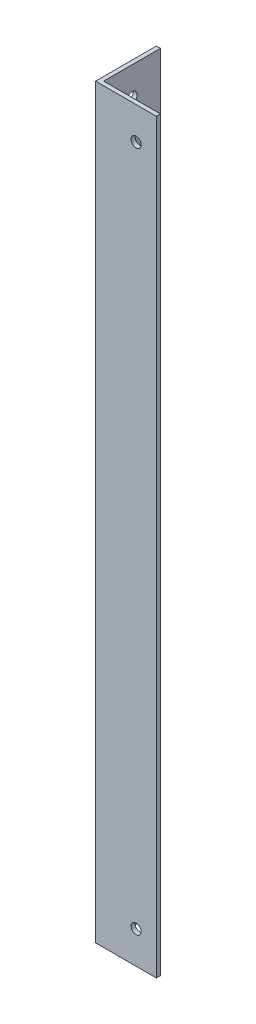
ISO-10303-21;
HEADER;
FILE_DESCRIPTION(('STEP AP214'),'2;1');
FILE_NAME('part.step','',(''),(''),'','','');
FILE_SCHEMA(('AUTOMOTIVE_DESIGN { 1 0 10303 214 1 1 1 1 }'));
ENDSEC;
DATA;
#1=APPLICATION_CONTEXT('core data for automotive mechanical design processes');
#2=APPLICATION_PROTOCOL_DEFINITION('international standard','automotive_design',2000,#1);
#3=PRODUCT_CONTEXT('',#1,'mechanical');
#4=PRODUCT('Part','Part','',(#3));
#5=PRODUCT_RELATED_PRODUCT_CATEGORY('part','',(#4));
#6=PRODUCT_DEFINITION_FORMATION('','',#4);
#7=PRODUCT_DEFINITION_CONTEXT('part definition',#1,'design');
#8=PRODUCT_DEFINITION('design','',#6,#7);
#9=PRODUCT_DEFINITION_SHAPE('','',#8);
#10=(LENGTH_UNIT() NAMED_UNIT(*) SI_UNIT(.MILLI.,.METRE.));
#11=(NAMED_UNIT(*) PLANE_ANGLE_UNIT() SI_UNIT($,.RADIAN.));
#12=(NAMED_UNIT(*) SI_UNIT($,.STERADIAN.) SOLID_ANGLE_UNIT());
#13=UNCERTAINTY_MEASURE_WITH_UNIT(LENGTH_MEASURE(1.E-05),#10,'distance_accuracy_value','');
#14=(GEOMETRIC_REPRESENTATION_CONTEXT(3) GLOBAL_UNCERTAINTY_ASSIGNED_CONTEXT((#13)) GLOBAL_UNIT_ASSIGNED_CONTEXT((#10,
#11,#12)) REPRESENTATION_CONTEXT('',''));
#15=CARTESIAN_POINT('',(0.,0.,0.));
#16=DIRECTION('',(0.,0.,1.));
#17=DIRECTION('',(1.,0.,0.));
#18=AXIS2_PLACEMENT_3D('',#15,#16,#17);
#19=CARTESIAN_POINT('',(0.,184.,0.));
#20=DIRECTION('',(0.,0.,1.));
#21=DIRECTION('',(1.,0.,0.));
#22=AXIS2_PLACEMENT_3D('',#19,#20,#21);
#23=PLANE('',#22);
#24=CARTESIAN_POINT('',(10.,8.,0.));
#25=DIRECTION('',(0.,0.,1.));
#26=DIRECTION('',(1.,0.,0.));
#27=AXIS2_PLACEMENT_3D('',#24,#25,#26);
#28=CIRCLE('',#27,1.24999999999999);
#29=CARTESIAN_POINT('',(11.25,8.,0.));
#30=VERTEX_POINT('',#29);
#31=EDGE_CURVE('E185',#30,#30,#28,.T.);
#32=ORIENTED_EDGE('',*,*,#31,.T.);
#33=EDGE_LOOP('',(#32));
#34=FACE_BOUND('',#33,.T.);
#35=CARTESIAN_POINT('',(10.,176.,0.));
#36=DIRECTION('',(0.,0.,1.));
#37=DIRECTION('',(1.,0.,0.));
#38=AXIS2_PLACEMENT_3D('',#35,#36,#37);
#39=CIRCLE('',#38,1.24999999999999);
#40=CARTESIAN_POINT('',(11.25,176.,0.));
#41=VERTEX_POINT('',#40);
#42=EDGE_CURVE('E184',#41,#41,#39,.T.);
#43=ORIENTED_EDGE('',*,*,#42,.T.);
#44=EDGE_LOOP('',(#43));
#45=FACE_BOUND('',#44,.T.);
#46=DIRECTION('',(0.,-1.,0.));
#47=VECTOR('',#46,1.);
#48=CARTESIAN_POINT('',(1.,184.,0.));
#49=LINE('',#48,#47);
#50=CARTESIAN_POINT('',(0.999999999999988,184.,0.));
#51=VERTEX_POINT('',#50);
#52=CARTESIAN_POINT('',(0.999999999999977,0.,0.));
#53=VERTEX_POINT('',#52);
#54=EDGE_CURVE('E49',#51,#53,#49,.T.);
#55=ORIENTED_EDGE('',*,*,#54,.F.);
#56=DIRECTION('',(-1.,0.,0.));
#57=VECTOR('',#56,1.);
#58=CARTESIAN_POINT('',(0.,184.,0.));
#59=LINE('',#58,#57);
#60=CARTESIAN_POINT('',(15.,184.,0.));
#61=VERTEX_POINT('',#60);
#62=EDGE_CURVE('E132',#61,#51,#59,.T.);
#63=ORIENTED_EDGE('',*,*,#62,.F.);
#64=DIRECTION('',(0.,-1.,0.));
#65=VECTOR('',#64,1.);
#66=CARTESIAN_POINT('',(15.,184.,0.));
#67=LINE('',#66,#65);
#68=CARTESIAN_POINT('',(15.,0.,0.));
#69=VERTEX_POINT('',#68);
#70=EDGE_CURVE('E134',#61,#69,#67,.T.);
#71=ORIENTED_EDGE('',*,*,#70,.T.);
#72=DIRECTION('',(-1.,0.,0.));
#73=VECTOR('',#72,1.);
#74=CARTESIAN_POINT('',(0.,0.,0.));
#75=LINE('',#74,#73);
#76=EDGE_CURVE('E102',#69,#53,#75,.T.);
#77=ORIENTED_EDGE('',*,*,#76,.T.);
#78=EDGE_LOOP('',(#55,#63,#71,#77));
#79=FACE_BOUND('',#78,.T.);
#80=ADVANCED_FACE('F34',(#34,#45,#79),#23,.F.);
#81=CARTESIAN_POINT('',(0.,184.,0.));
#82=DIRECTION('',(1.,0.,0.));
#83=DIRECTION('',(0.,0.,-1.));
#84=AXIS2_PLACEMENT_3D('',#81,#82,#83);
#85=PLANE('',#84);
#86=CARTESIAN_POINT('',(0.,7.,-7.));
#87=DIRECTION('',(-1.,0.,0.));
#88=DIRECTION('',(0.,0.,1.));
#89=AXIS2_PLACEMENT_3D('',#86,#87,#88);
#90=CIRCLE('',#89,1.24999999999999);
#91=CARTESIAN_POINT('',(0.,7.,-5.75000000000001));
#92=VERTEX_POINT('',#91);
#93=EDGE_CURVE('E188',#92,#92,#90,.T.);
#94=ORIENTED_EDGE('',*,*,#93,.F.);
#95=EDGE_LOOP('',(#94));
#96=FACE_BOUND('',#95,.T.);
#97=CARTESIAN_POINT('',(0.,177.,-7.));
#98=DIRECTION('',(-1.,0.,0.));
#99=DIRECTION('',(0.,0.,1.));
#100=AXIS2_PLACEMENT_3D('',#97,#98,#99);
#101=CIRCLE('',#100,1.24999999999997);
#102=CARTESIAN_POINT('',(0.,177.,-5.75000000000003));
#103=VERTEX_POINT('',#102);
#104=EDGE_CURVE('E196',#103,#103,#101,.T.);
#105=ORIENTED_EDGE('',*,*,#104,.F.);
#106=EDGE_LOOP('',(#105));
#107=FACE_BOUND('',#106,.T.);
#108=DIRECTION('',(0.,0.,1.));
#109=VECTOR('',#108,1.);
#110=CARTESIAN_POINT('',(0.,0.,0.));
#111=LINE('',#110,#109);
#112=CARTESIAN_POINT('',(0.,0.,-14.));
#113=VERTEX_POINT('',#112);
#114=CARTESIAN_POINT('',(0.,0.,1.));
#115=VERTEX_POINT('',#114);
#116=EDGE_CURVE('E128',#113,#115,#111,.T.);
#117=ORIENTED_EDGE('',*,*,#116,.T.);
#118=DIRECTION('',(0.,-1.,0.));
#119=VECTOR('',#118,1.);
#120=CARTESIAN_POINT('',(0.,184.,1.));
#121=LINE('',#120,#119);
#122=CARTESIAN_POINT('',(0.,184.,1.));
#123=VERTEX_POINT('',#122);
#124=EDGE_CURVE('E11',#123,#115,#121,.T.);
#125=ORIENTED_EDGE('',*,*,#124,.F.);
#126=DIRECTION('',(0.,0.,1.));
#127=VECTOR('',#126,1.);
#128=CARTESIAN_POINT('',(0.,184.,0.));
#129=LINE('',#128,#127);
#130=CARTESIAN_POINT('',(0.,184.,-14.));
#131=VERTEX_POINT('',#130);
#132=EDGE_CURVE('E97',#131,#123,#129,.T.);
#133=ORIENTED_EDGE('',*,*,#132,.F.);
#134=DIRECTION('',(0.,1.,0.));
#135=VECTOR('',#134,1.);
#136=CARTESIAN_POINT('',(0.,184.,-14.));
#137=LINE('',#136,#135);
#138=EDGE_CURVE('E101',#113,#131,#137,.T.);
#139=ORIENTED_EDGE('',*,*,#138,.F.);
#140=EDGE_LOOP('',(#117,#125,#133,#139));
#141=FACE_BOUND('',#140,.T.);
#142=ADVANCED_FACE('F36',(#96,#107,#141),#85,.F.);
#143=CARTESIAN_POINT('',(0.,184.,1.));
#144=DIRECTION('',(0.,0.,-1.));
#145=DIRECTION('',(-1.,0.,0.));
#146=AXIS2_PLACEMENT_3D('',#143,#144,#145);
#147=PLANE('',#146);
#148=CARTESIAN_POINT('',(10.,8.,1.));
#149=DIRECTION('',(0.,0.,1.));
#150=DIRECTION('',(1.,0.,0.));
#151=AXIS2_PLACEMENT_3D('',#148,#149,#150);
#152=CIRCLE('',#151,1.24999999999999);
#153=CARTESIAN_POINT('',(11.25,8.,1.));
#154=VERTEX_POINT('',#153);
#155=EDGE_CURVE('E179',#154,#154,#152,.T.);
#156=ORIENTED_EDGE('',*,*,#155,.F.);
#157=EDGE_LOOP('',(#156));
#158=FACE_BOUND('',#157,.T.);
#159=CARTESIAN_POINT('',(10.,176.,1.));
#160=DIRECTION('',(0.,0.,1.));
#161=DIRECTION('',(1.,0.,0.));
#162=AXIS2_PLACEMENT_3D('',#159,#160,#161);
#163=CIRCLE('',#162,1.24999999999999);
#164=CARTESIAN_POINT('',(11.25,176.,1.));
#165=VERTEX_POINT('',#164);
#166=EDGE_CURVE('E182',#165,#165,#163,.T.);
#167=ORIENTED_EDGE('',*,*,#166,.F.);
#168=EDGE_LOOP('',(#167));
#169=FACE_BOUND('',#168,.T.);
#170=DIRECTION('',(1.,0.,0.));
#171=VECTOR('',#170,1.);
#172=CARTESIAN_POINT('',(0.,0.,1.));
#173=LINE('',#172,#171);
#174=CARTESIAN_POINT('',(15.,0.,1.));
#175=VERTEX_POINT('',#174);
#176=EDGE_CURVE('E136',#115,#175,#173,.T.);
#177=ORIENTED_EDGE('',*,*,#176,.T.);
#178=DIRECTION('',(0.,-1.,0.));
#179=VECTOR('',#178,1.);
#180=CARTESIAN_POINT('',(15.,184.,1.));
#181=LINE('',#180,#179);
#182=CARTESIAN_POINT('',(15.,184.,1.));
#183=VERTEX_POINT('',#182);
#184=EDGE_CURVE('E42',#183,#175,#181,.T.);
#185=ORIENTED_EDGE('',*,*,#184,.F.);
#186=DIRECTION('',(1.,0.,0.));
#187=VECTOR('',#186,1.);
#188=CARTESIAN_POINT('',(0.,184.,1.));
#189=LINE('',#188,#187);
#190=EDGE_CURVE('E79',#123,#183,#189,.T.);
#191=ORIENTED_EDGE('',*,*,#190,.F.);
#192=ORIENTED_EDGE('',*,*,#124,.T.);
#193=EDGE_LOOP('',(#177,#185,#191,#192));
#194=FACE_BOUND('',#193,.T.);
#195=ADVANCED_FACE('F166',(#158,#169,#194),#147,.F.);
#196=CARTESIAN_POINT('',(15.,184.,0.));
#197=DIRECTION('',(-1.,0.,0.));
#198=DIRECTION('',(0.,0.,1.));
#199=AXIS2_PLACEMENT_3D('',#196,#197,#198);
#200=PLANE('',#199);
#201=DIRECTION('',(0.,0.,-1.));
#202=VECTOR('',#201,1.);
#203=CARTESIAN_POINT('',(15.,0.,0.));
#204=LINE('',#203,#202);
#205=EDGE_CURVE('E74',#175,#69,#204,.T.);
#206=ORIENTED_EDGE('',*,*,#205,.T.);
#207=ORIENTED_EDGE('',*,*,#70,.F.);
#208=DIRECTION('',(0.,0.,-1.));
#209=VECTOR('',#208,1.);
#210=CARTESIAN_POINT('',(15.,184.,0.));
#211=LINE('',#210,#209);
#212=EDGE_CURVE('E57',#183,#61,#211,.T.);
#213=ORIENTED_EDGE('',*,*,#212,.F.);
#214=ORIENTED_EDGE('',*,*,#184,.T.);
#215=EDGE_LOOP('',(#206,#207,#213,#214));
#216=FACE_BOUND('',#215,.T.);
#217=ADVANCED_FACE('F140',(#216),#200,.F.);
#218=CARTESIAN_POINT('',(0.,184.,0.));
#219=DIRECTION('',(0.,1.,0.));
#220=DIRECTION('',(0.,0.,1.));
#221=AXIS2_PLACEMENT_3D('',#218,#219,#220);
#222=PLANE('',#221);
#223=ORIENTED_EDGE('',*,*,#132,.T.);
#224=ORIENTED_EDGE('',*,*,#190,.T.);
#225=ORIENTED_EDGE('',*,*,#212,.T.);
#226=ORIENTED_EDGE('',*,*,#62,.T.);
#227=DIRECTION('',(0.,0.,1.));
#228=VECTOR('',#227,1.);
#229=CARTESIAN_POINT('',(1.,184.,-14.));
#230=LINE('',#229,#228);
#231=CARTESIAN_POINT('',(1.,184.,-14.));
#232=VERTEX_POINT('',#231);
#233=EDGE_CURVE('E108',#232,#51,#230,.T.);
#234=ORIENTED_EDGE('',*,*,#233,.F.);
#235=DIRECTION('',(1.,0.,0.));
#236=VECTOR('',#235,1.);
#237=CARTESIAN_POINT('',(0.,184.,-14.));
#238=LINE('',#237,#236);
#239=EDGE_CURVE('E105',#131,#232,#238,.T.);
#240=ORIENTED_EDGE('',*,*,#239,.F.);
#241=EDGE_LOOP('',(#223,#224,#225,#226,#234,#240));
#242=FACE_BOUND('',#241,.T.);
#243=ADVANCED_FACE('F106',(#242),#222,.T.);
#244=CARTESIAN_POINT('',(0.,0.,0.));
#245=DIRECTION('',(0.,1.,0.));
#246=DIRECTION('',(0.,0.,1.));
#247=AXIS2_PLACEMENT_3D('',#244,#245,#246);
#248=PLANE('',#247);
#249=ORIENTED_EDGE('',*,*,#116,.F.);
#250=DIRECTION('',(-1.,0.,0.));
#251=VECTOR('',#250,1.);
#252=CARTESIAN_POINT('',(0.,0.,-14.));
#253=LINE('',#252,#251);
#254=CARTESIAN_POINT('',(0.999999999999977,0.,-14.));
#255=VERTEX_POINT('',#254);
#256=EDGE_CURVE('E116',#255,#113,#253,.T.);
#257=ORIENTED_EDGE('',*,*,#256,.F.);
#258=DIRECTION('',(0.,0.,1.));
#259=VECTOR('',#258,1.);
#260=CARTESIAN_POINT('',(0.999999999999977,0.,-14.));
#261=LINE('',#260,#259);
#262=EDGE_CURVE('E124',#255,#53,#261,.T.);
#263=ORIENTED_EDGE('',*,*,#262,.T.);
#264=ORIENTED_EDGE('',*,*,#76,.F.);
#265=ORIENTED_EDGE('',*,*,#205,.F.);
#266=ORIENTED_EDGE('',*,*,#176,.F.);
#267=EDGE_LOOP('',(#249,#257,#263,#264,#265,#266));
#268=FACE_BOUND('',#267,.T.);
#269=ADVANCED_FACE('F143',(#268),#248,.F.);
#270=CARTESIAN_POINT('',(1.,184.,-14.));
#271=DIRECTION('',(-1.,0.,0.));
#272=DIRECTION('',(0.,-1.,0.));
#273=AXIS2_PLACEMENT_3D('',#270,#271,#272);
#274=PLANE('',#273);
#275=CARTESIAN_POINT('',(0.999999999999978,7.,-7.));
#276=DIRECTION('',(-1.,0.,0.));
#277=DIRECTION('',(0.,-1.,0.));
#278=AXIS2_PLACEMENT_3D('',#275,#276,#277);
#279=CIRCLE('',#278,1.24999999999999);
#280=CARTESIAN_POINT('',(0.999999999999978,5.75000000000001,-7.));
#281=VERTEX_POINT('',#280);
#282=EDGE_CURVE('E195',#281,#281,#279,.T.);
#283=ORIENTED_EDGE('',*,*,#282,.T.);
#284=EDGE_LOOP('',(#283));
#285=FACE_BOUND('',#284,.T.);
#286=CARTESIAN_POINT('',(0.999999999999999,177.,-7.));
#287=DIRECTION('',(-1.,0.,0.));
#288=DIRECTION('',(0.,-1.,0.));
#289=AXIS2_PLACEMENT_3D('',#286,#287,#288);
#290=CIRCLE('',#289,1.24999999999997);
#291=CARTESIAN_POINT('',(0.999999999999999,175.75,-7.));
#292=VERTEX_POINT('',#291);
#293=EDGE_CURVE('E118',#292,#292,#290,.T.);
#294=ORIENTED_EDGE('',*,*,#293,.T.);
#295=EDGE_LOOP('',(#294));
#296=FACE_BOUND('',#295,.T.);
#297=ORIENTED_EDGE('',*,*,#54,.T.);
#298=ORIENTED_EDGE('',*,*,#262,.F.);
#299=DIRECTION('',(0.,-1.,0.));
#300=VECTOR('',#299,1.);
#301=CARTESIAN_POINT('',(1.,184.,-14.));
#302=LINE('',#301,#300);
#303=EDGE_CURVE('E111',#232,#255,#302,.T.);
#304=ORIENTED_EDGE('',*,*,#303,.F.);
#305=ORIENTED_EDGE('',*,*,#233,.T.);
#306=EDGE_LOOP('',(#297,#298,#304,#305));
#307=FACE_BOUND('',#306,.T.);
#308=ADVANCED_FACE('F146',(#285,#296,#307),#274,.F.);
#309=CARTESIAN_POINT('',(0.,0.,-14.));
#310=DIRECTION('',(0.,0.,1.));
#311=DIRECTION('',(1.,0.,0.));
#312=AXIS2_PLACEMENT_3D('',#309,#310,#311);
#313=PLANE('',#312);
#314=ORIENTED_EDGE('',*,*,#138,.T.);
#315=ORIENTED_EDGE('',*,*,#239,.T.);
#316=ORIENTED_EDGE('',*,*,#303,.T.);
#317=ORIENTED_EDGE('',*,*,#256,.T.);
#318=EDGE_LOOP('',(#314,#315,#316,#317));
#319=FACE_BOUND('',#318,.T.);
#320=ADVANCED_FACE('F114',(#319),#313,.F.);
#321=CARTESIAN_POINT('',(0.,177.,-7.));
#322=DIRECTION('',(-1.,0.,0.));
#323=DIRECTION('',(0.,0.,1.));
#324=AXIS2_PLACEMENT_3D('',#321,#322,#323);
#325=CYLINDRICAL_SURFACE('',#324,1.24999999999997);
#326=ORIENTED_EDGE('',*,*,#104,.T.);
#327=EDGE_LOOP('',(#326));
#328=FACE_BOUND('',#327,.T.);
#329=ORIENTED_EDGE('',*,*,#293,.F.);
#330=EDGE_LOOP('',(#329));
#331=FACE_BOUND('',#330,.T.);
#332=ADVANCED_FACE('F154',(#328,#331),#325,.F.);
#333=CARTESIAN_POINT('',(0.,7.,-7.));
#334=DIRECTION('',(-1.,0.,0.));
#335=DIRECTION('',(0.,0.,1.));
#336=AXIS2_PLACEMENT_3D('',#333,#334,#335);
#337=CYLINDRICAL_SURFACE('',#336,1.24999999999999);
#338=ORIENTED_EDGE('',*,*,#93,.T.);
#339=EDGE_LOOP('',(#338));
#340=FACE_BOUND('',#339,.T.);
#341=ORIENTED_EDGE('',*,*,#282,.F.);
#342=EDGE_LOOP('',(#341));
#343=FACE_BOUND('',#342,.T.);
#344=ADVANCED_FACE('F204',(#340,#343),#337,.F.);
#345=CARTESIAN_POINT('',(10.,176.,1.));
#346=DIRECTION('',(0.,0.,1.));
#347=DIRECTION('',(1.,0.,0.));
#348=AXIS2_PLACEMENT_3D('',#345,#346,#347);
#349=CYLINDRICAL_SURFACE('',#348,1.24999999999999);
#350=ORIENTED_EDGE('',*,*,#166,.T.);
#351=EDGE_LOOP('',(#350));
#352=FACE_BOUND('',#351,.T.);
#353=ORIENTED_EDGE('',*,*,#42,.F.);
#354=EDGE_LOOP('',(#353));
#355=FACE_BOUND('',#354,.T.);
#356=ADVANCED_FACE('F209',(#352,#355),#349,.F.);
#357=CARTESIAN_POINT('',(10.,8.,1.));
#358=DIRECTION('',(0.,0.,1.));
#359=DIRECTION('',(1.,0.,0.));
#360=AXIS2_PLACEMENT_3D('',#357,#358,#359);
#361=CYLINDRICAL_SURFACE('',#360,1.24999999999999);
#362=ORIENTED_EDGE('',*,*,#155,.T.);
#363=EDGE_LOOP('',(#362));
#364=FACE_BOUND('',#363,.T.);
#365=ORIENTED_EDGE('',*,*,#31,.F.);
#366=EDGE_LOOP('',(#365));
#367=FACE_BOUND('',#366,.T.);
#368=ADVANCED_FACE('F215',(#364,#367),#361,.F.);
#369=CLOSED_SHELL('',(#80,#142,#195,#217,#243,#269,#308,#320,#332,#344,#356,#368));
#370=MANIFOLD_SOLID_BREP('B2',#369);
#371=ADVANCED_BREP_SHAPE_REPRESENTATION('',(#18,#370),#14);
#372=SHAPE_DEFINITION_REPRESENTATION(#9,#371);
ENDSEC;
END-ISO-10303-21;
